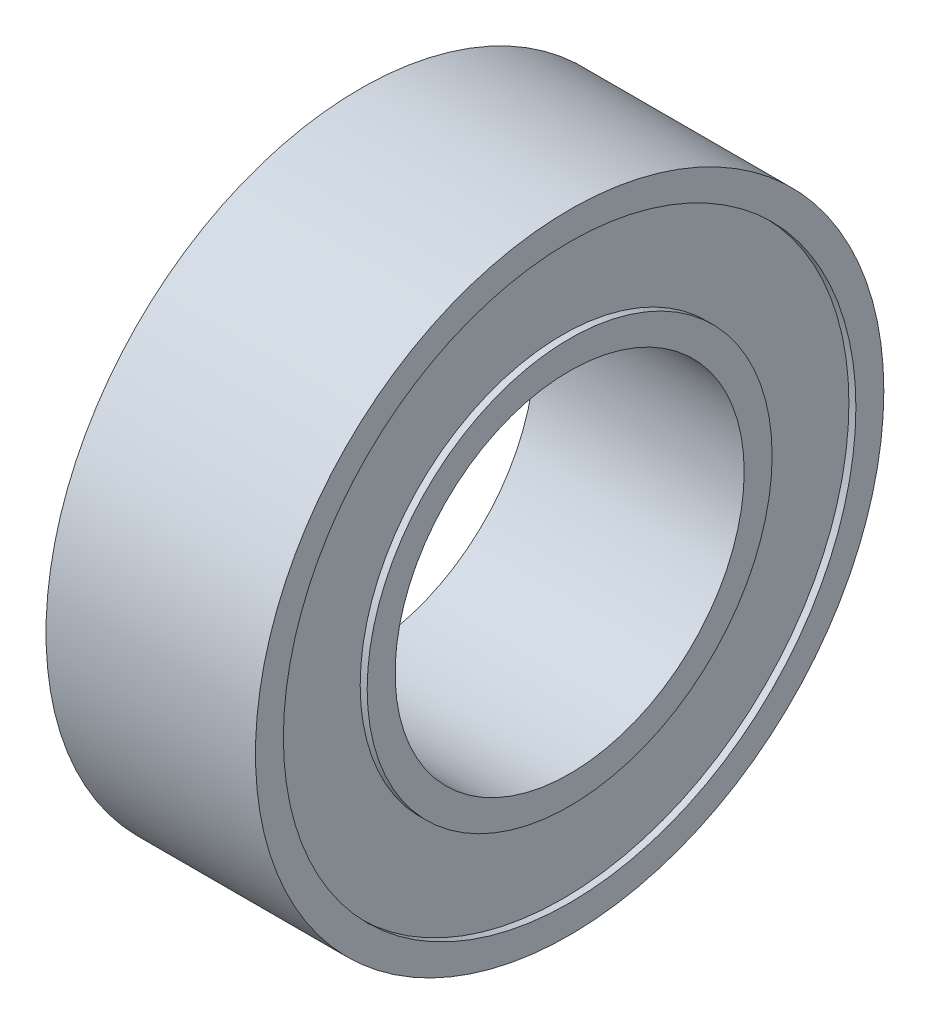
ISO-10303-21;
HEADER;
FILE_DESCRIPTION(('STEP AP214'),'2;1');
FILE_NAME('part.step','',(''),(''),'','','');
FILE_SCHEMA(('AUTOMOTIVE_DESIGN { 1 0 10303 214 1 1 1 1 }'));
ENDSEC;
DATA;
#1=APPLICATION_CONTEXT('core data for automotive mechanical design processes');
#2=APPLICATION_PROTOCOL_DEFINITION('international standard','automotive_design',2000,#1);
#3=PRODUCT_CONTEXT('',#1,'mechanical');
#4=PRODUCT('Part','Part','',(#3));
#5=PRODUCT_RELATED_PRODUCT_CATEGORY('part','',(#4));
#6=PRODUCT_DEFINITION_FORMATION('','',#4);
#7=PRODUCT_DEFINITION_CONTEXT('part definition',#1,'design');
#8=PRODUCT_DEFINITION('design','',#6,#7);
#9=PRODUCT_DEFINITION_SHAPE('','',#8);
#10=(LENGTH_UNIT() NAMED_UNIT(*) SI_UNIT(.MILLI.,.METRE.));
#11=(NAMED_UNIT(*) PLANE_ANGLE_UNIT() SI_UNIT($,.RADIAN.));
#12=(NAMED_UNIT(*) SI_UNIT($,.STERADIAN.) SOLID_ANGLE_UNIT());
#13=UNCERTAINTY_MEASURE_WITH_UNIT(LENGTH_MEASURE(1.E-05),#10,'distance_accuracy_value','');
#14=(GEOMETRIC_REPRESENTATION_CONTEXT(3) GLOBAL_UNCERTAINTY_ASSIGNED_CONTEXT((#13)) GLOBAL_UNIT_ASSIGNED_CONTEXT((#10,
#11,#12)) REPRESENTATION_CONTEXT('',''));
#15=CARTESIAN_POINT('',(0.,0.,0.));
#16=DIRECTION('',(0.,0.,1.));
#17=DIRECTION('',(1.,0.,0.));
#18=AXIS2_PLACEMENT_3D('',#15,#16,#17);
#19=CARTESIAN_POINT('',(0.,0.,0.));
#20=DIRECTION('',(1.,0.,0.));
#21=DIRECTION('',(0.,0.,-1.));
#22=AXIS2_PLACEMENT_3D('',#19,#20,#21);
#23=PLANE('',#22);
#24=CARTESIAN_POINT('',(0.,0.,0.));
#25=DIRECTION('',(1.,0.,0.));
#26=DIRECTION('',(0.,0.,-1.));
#27=AXIS2_PLACEMENT_3D('',#24,#25,#26);
#28=CIRCLE('',#27,2.5);
#29=CARTESIAN_POINT('',(0.,0.,-2.5));
#30=VERTEX_POINT('',#29);
#31=EDGE_CURVE('E50',#30,#30,#28,.T.);
#32=ORIENTED_EDGE('',*,*,#31,.T.);
#33=EDGE_LOOP('',(#32));
#34=FACE_BOUND('',#33,.T.);
#35=CARTESIAN_POINT('',(0.,0.,0.));
#36=DIRECTION('',(-1.,0.,0.));
#37=DIRECTION('',(0.,0.,1.));
#38=AXIS2_PLACEMENT_3D('',#35,#36,#37);
#39=CIRCLE('',#38,2.9);
#40=CARTESIAN_POINT('',(0.,0.,2.9));
#41=VERTEX_POINT('',#40);
#42=EDGE_CURVE('E74',#41,#41,#39,.T.);
#43=ORIENTED_EDGE('',*,*,#42,.T.);
#44=EDGE_LOOP('',(#43));
#45=FACE_BOUND('',#44,.T.);
#46=ADVANCED_FACE('F37',(#34,#45),#23,.F.);
#47=CARTESIAN_POINT('',(3.,0.,0.));
#48=DIRECTION('',(1.,0.,0.));
#49=DIRECTION('',(0.,0.,-1.));
#50=AXIS2_PLACEMENT_3D('',#47,#48,#49);
#51=PLANE('',#50);
#52=CARTESIAN_POINT('',(3.,0.,0.));
#53=DIRECTION('',(1.,0.,0.));
#54=DIRECTION('',(0.,0.,-1.));
#55=AXIS2_PLACEMENT_3D('',#52,#53,#54);
#56=CIRCLE('',#55,2.5);
#57=CARTESIAN_POINT('',(3.,0.,-2.5));
#58=VERTEX_POINT('',#57);
#59=EDGE_CURVE('E48',#58,#58,#56,.T.);
#60=ORIENTED_EDGE('',*,*,#59,.F.);
#61=EDGE_LOOP('',(#60));
#62=FACE_BOUND('',#61,.T.);
#63=CARTESIAN_POINT('',(3.,0.,0.));
#64=DIRECTION('',(1.,0.,0.));
#65=DIRECTION('',(0.,0.,-1.));
#66=AXIS2_PLACEMENT_3D('',#63,#64,#65);
#67=CIRCLE('',#66,2.9);
#68=CARTESIAN_POINT('',(3.,0.,-2.9));
#69=VERTEX_POINT('',#68);
#70=EDGE_CURVE('E62',#69,#69,#67,.T.);
#71=ORIENTED_EDGE('',*,*,#70,.T.);
#72=EDGE_LOOP('',(#71));
#73=FACE_BOUND('',#72,.T.);
#74=ADVANCED_FACE('F112',(#62,#73),#51,.T.);
#75=CARTESIAN_POINT('',(3.,0.,0.));
#76=DIRECTION('',(1.,0.,0.));
#77=DIRECTION('',(0.,0.,-1.));
#78=AXIS2_PLACEMENT_3D('',#75,#76,#77);
#79=CIRCLE('',#78,4.1);
#80=CARTESIAN_POINT('',(3.,0.,-4.1));
#81=VERTEX_POINT('',#80);
#82=EDGE_CURVE('E56',#81,#81,#79,.T.);
#83=ORIENTED_EDGE('',*,*,#82,.F.);
#84=EDGE_LOOP('',(#83));
#85=FACE_BOUND('',#84,.T.);
#86=CARTESIAN_POINT('',(3.,0.,0.));
#87=DIRECTION('',(1.,0.,0.));
#88=DIRECTION('',(0.,0.,-1.));
#89=AXIS2_PLACEMENT_3D('',#86,#87,#88);
#90=CIRCLE('',#89,4.5);
#91=CARTESIAN_POINT('',(3.,0.,-4.5));
#92=VERTEX_POINT('',#91);
#93=EDGE_CURVE('E10',#92,#92,#90,.T.);
#94=ORIENTED_EDGE('',*,*,#93,.T.);
#95=EDGE_LOOP('',(#94));
#96=FACE_BOUND('',#95,.T.);
#97=ADVANCED_FACE('F99',(#85,#96),#51,.T.);
#98=CARTESIAN_POINT('',(0.,0.,0.));
#99=DIRECTION('',(-1.,0.,0.));
#100=DIRECTION('',(0.,0.,1.));
#101=AXIS2_PLACEMENT_3D('',#98,#99,#100);
#102=CIRCLE('',#101,4.1);
#103=CARTESIAN_POINT('',(0.,0.,4.1));
#104=VERTEX_POINT('',#103);
#105=EDGE_CURVE('E68',#104,#104,#102,.T.);
#106=ORIENTED_EDGE('',*,*,#105,.F.);
#107=EDGE_LOOP('',(#106));
#108=FACE_BOUND('',#107,.T.);
#109=CARTESIAN_POINT('',(0.,0.,0.));
#110=DIRECTION('',(1.,0.,0.));
#111=DIRECTION('',(0.,0.,-1.));
#112=AXIS2_PLACEMENT_3D('',#109,#110,#111);
#113=CIRCLE('',#112,4.5);
#114=CARTESIAN_POINT('',(0.,0.,-4.5));
#115=VERTEX_POINT('',#114);
#116=EDGE_CURVE('E41',#115,#115,#113,.T.);
#117=ORIENTED_EDGE('',*,*,#116,.F.);
#118=EDGE_LOOP('',(#117));
#119=FACE_BOUND('',#118,.T.);
#120=ADVANCED_FACE('F96',(#108,#119),#23,.F.);
#121=CARTESIAN_POINT('',(3.,0.,0.));
#122=DIRECTION('',(-1.,0.,0.));
#123=DIRECTION('',(0.,0.,1.));
#124=AXIS2_PLACEMENT_3D('',#121,#122,#123);
#125=CYLINDRICAL_SURFACE('',#124,4.5);
#126=ORIENTED_EDGE('',*,*,#93,.F.);
#127=EDGE_LOOP('',(#126));
#128=FACE_BOUND('',#127,.T.);
#129=ORIENTED_EDGE('',*,*,#116,.T.);
#130=EDGE_LOOP('',(#129));
#131=FACE_BOUND('',#130,.T.);
#132=ADVANCED_FACE('F39',(#128,#131),#125,.T.);
#133=CARTESIAN_POINT('',(3.,0.,0.));
#134=DIRECTION('',(-1.,0.,0.));
#135=DIRECTION('',(0.,0.,1.));
#136=AXIS2_PLACEMENT_3D('',#133,#134,#135);
#137=CYLINDRICAL_SURFACE('',#136,2.5);
#138=ORIENTED_EDGE('',*,*,#59,.T.);
#139=EDGE_LOOP('',(#138));
#140=FACE_BOUND('',#139,.T.);
#141=ORIENTED_EDGE('',*,*,#31,.F.);
#142=EDGE_LOOP('',(#141));
#143=FACE_BOUND('',#142,.T.);
#144=ADVANCED_FACE('F103',(#140,#143),#137,.F.);
#145=CARTESIAN_POINT('',(2.9,0.,0.));
#146=DIRECTION('',(1.,0.,0.));
#147=DIRECTION('',(0.,0.,-1.));
#148=AXIS2_PLACEMENT_3D('',#145,#146,#147);
#149=CYLINDRICAL_SURFACE('',#148,4.1);
#150=CARTESIAN_POINT('',(2.9,0.,0.));
#151=DIRECTION('',(1.,0.,0.));
#152=DIRECTION('',(0.,0.,-1.));
#153=AXIS2_PLACEMENT_3D('',#150,#151,#152);
#154=CIRCLE('',#153,4.1);
#155=CARTESIAN_POINT('',(2.9,0.,-4.1));
#156=VERTEX_POINT('',#155);
#157=EDGE_CURVE('E53',#156,#156,#154,.T.);
#158=ORIENTED_EDGE('',*,*,#157,.F.);
#159=EDGE_LOOP('',(#158));
#160=FACE_BOUND('',#159,.T.);
#161=ORIENTED_EDGE('',*,*,#82,.T.);
#162=EDGE_LOOP('',(#161));
#163=FACE_BOUND('',#162,.T.);
#164=ADVANCED_FACE('F108',(#160,#163),#149,.F.);
#165=CARTESIAN_POINT('',(2.9,0.,0.));
#166=DIRECTION('',(1.,0.,0.));
#167=DIRECTION('',(0.,0.,-1.));
#168=AXIS2_PLACEMENT_3D('',#165,#166,#167);
#169=PLANE('',#168);
#170=CARTESIAN_POINT('',(2.9,0.,0.));
#171=DIRECTION('',(1.,0.,0.));
#172=DIRECTION('',(0.,0.,-1.));
#173=AXIS2_PLACEMENT_3D('',#170,#171,#172);
#174=CIRCLE('',#173,2.9);
#175=CARTESIAN_POINT('',(2.9,0.,-2.9));
#176=VERTEX_POINT('',#175);
#177=EDGE_CURVE('E59',#176,#176,#174,.T.);
#178=ORIENTED_EDGE('',*,*,#177,.F.);
#179=EDGE_LOOP('',(#178));
#180=FACE_BOUND('',#179,.T.);
#181=ORIENTED_EDGE('',*,*,#157,.T.);
#182=EDGE_LOOP('',(#181));
#183=FACE_BOUND('',#182,.T.);
#184=ADVANCED_FACE('F126',(#180,#183),#169,.T.);
#185=CARTESIAN_POINT('',(2.9,0.,0.));
#186=DIRECTION('',(1.,0.,0.));
#187=DIRECTION('',(0.,0.,-1.));
#188=AXIS2_PLACEMENT_3D('',#185,#186,#187);
#189=CYLINDRICAL_SURFACE('',#188,2.9);
#190=ORIENTED_EDGE('',*,*,#177,.T.);
#191=EDGE_LOOP('',(#190));
#192=FACE_BOUND('',#191,.T.);
#193=ORIENTED_EDGE('',*,*,#70,.F.);
#194=EDGE_LOOP('',(#193));
#195=FACE_BOUND('',#194,.T.);
#196=ADVANCED_FACE('F92',(#192,#195),#189,.T.);
#197=CARTESIAN_POINT('',(0.1,0.,0.));
#198=DIRECTION('',(-1.,0.,0.));
#199=DIRECTION('',(0.,0.,1.));
#200=AXIS2_PLACEMENT_3D('',#197,#198,#199);
#201=CYLINDRICAL_SURFACE('',#200,4.1);
#202=CARTESIAN_POINT('',(0.1,0.,0.));
#203=DIRECTION('',(-1.,0.,0.));
#204=DIRECTION('',(0.,0.,1.));
#205=AXIS2_PLACEMENT_3D('',#202,#203,#204);
#206=CIRCLE('',#205,4.1);
#207=CARTESIAN_POINT('',(0.1,0.,4.1));
#208=VERTEX_POINT('',#207);
#209=EDGE_CURVE('E65',#208,#208,#206,.T.);
#210=ORIENTED_EDGE('',*,*,#209,.F.);
#211=EDGE_LOOP('',(#210));
#212=FACE_BOUND('',#211,.T.);
#213=ORIENTED_EDGE('',*,*,#105,.T.);
#214=EDGE_LOOP('',(#213));
#215=FACE_BOUND('',#214,.T.);
#216=ADVANCED_FACE('F86',(#212,#215),#201,.F.);
#217=CARTESIAN_POINT('',(0.1,0.,0.));
#218=DIRECTION('',(-1.,0.,0.));
#219=DIRECTION('',(0.,0.,1.));
#220=AXIS2_PLACEMENT_3D('',#217,#218,#219);
#221=PLANE('',#220);
#222=CARTESIAN_POINT('',(0.1,0.,0.));
#223=DIRECTION('',(-1.,0.,0.));
#224=DIRECTION('',(0.,0.,1.));
#225=AXIS2_PLACEMENT_3D('',#222,#223,#224);
#226=CIRCLE('',#225,2.9);
#227=CARTESIAN_POINT('',(0.1,0.,2.9));
#228=VERTEX_POINT('',#227);
#229=EDGE_CURVE('E71',#228,#228,#226,.T.);
#230=ORIENTED_EDGE('',*,*,#229,.F.);
#231=EDGE_LOOP('',(#230));
#232=FACE_BOUND('',#231,.T.);
#233=ORIENTED_EDGE('',*,*,#209,.T.);
#234=EDGE_LOOP('',(#233));
#235=FACE_BOUND('',#234,.T.);
#236=ADVANCED_FACE('F83',(#232,#235),#221,.T.);
#237=CARTESIAN_POINT('',(0.1,0.,0.));
#238=DIRECTION('',(-1.,0.,0.));
#239=DIRECTION('',(0.,0.,1.));
#240=AXIS2_PLACEMENT_3D('',#237,#238,#239);
#241=CYLINDRICAL_SURFACE('',#240,2.9);
#242=ORIENTED_EDGE('',*,*,#229,.T.);
#243=EDGE_LOOP('',(#242));
#244=FACE_BOUND('',#243,.T.);
#245=ORIENTED_EDGE('',*,*,#42,.F.);
#246=EDGE_LOOP('',(#245));
#247=FACE_BOUND('',#246,.T.);
#248=ADVANCED_FACE('F80',(#244,#247),#241,.T.);
#249=CLOSED_SHELL('',(#46,#74,#97,#120,#132,#144,#164,#184,#196,#216,#236,#248));
#250=MANIFOLD_SOLID_BREP('B2',#249);
#251=ADVANCED_BREP_SHAPE_REPRESENTATION('',(#18,#250),#14);
#252=SHAPE_DEFINITION_REPRESENTATION(#9,#251);
ENDSEC;
END-ISO-10303-21;
